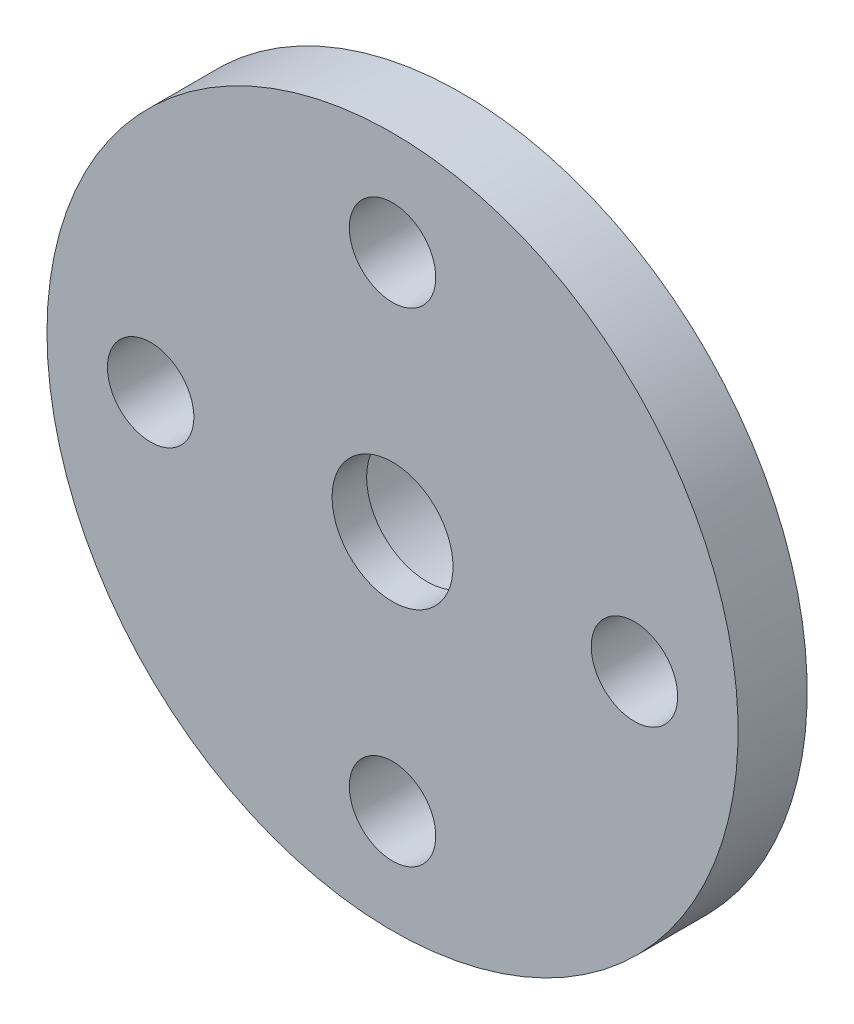
ISO-10303-21;
HEADER;
FILE_DESCRIPTION(('STEP AP214'),'2;1');
FILE_NAME('part.step','',(''),(''),'','','');
FILE_SCHEMA(('AUTOMOTIVE_DESIGN { 1 0 10303 214 1 1 1 1 }'));
ENDSEC;
DATA;
#1=APPLICATION_CONTEXT('core data for automotive mechanical design processes');
#2=APPLICATION_PROTOCOL_DEFINITION('international standard','automotive_design',2000,#1);
#3=PRODUCT_CONTEXT('',#1,'mechanical');
#4=PRODUCT('Part','Part','',(#3));
#5=PRODUCT_RELATED_PRODUCT_CATEGORY('part','',(#4));
#6=PRODUCT_DEFINITION_FORMATION('','',#4);
#7=PRODUCT_DEFINITION_CONTEXT('part definition',#1,'design');
#8=PRODUCT_DEFINITION('design','',#6,#7);
#9=PRODUCT_DEFINITION_SHAPE('','',#8);
#10=(LENGTH_UNIT() NAMED_UNIT(*) SI_UNIT(.MILLI.,.METRE.));
#11=(NAMED_UNIT(*) PLANE_ANGLE_UNIT() SI_UNIT($,.RADIAN.));
#12=(NAMED_UNIT(*) SI_UNIT($,.STERADIAN.) SOLID_ANGLE_UNIT());
#13=UNCERTAINTY_MEASURE_WITH_UNIT(LENGTH_MEASURE(1.E-05),#10,'distance_accuracy_value','');
#14=(GEOMETRIC_REPRESENTATION_CONTEXT(3) GLOBAL_UNCERTAINTY_ASSIGNED_CONTEXT((#13)) GLOBAL_UNIT_ASSIGNED_CONTEXT((#10,
#11,#12)) REPRESENTATION_CONTEXT('',''));
#15=CARTESIAN_POINT('',(0.,0.,0.));
#16=DIRECTION('',(0.,0.,1.));
#17=DIRECTION('',(1.,0.,0.));
#18=AXIS2_PLACEMENT_3D('',#15,#16,#17);
#19=CARTESIAN_POINT('',(0.,0.,-13.3602661537883));
#20=DIRECTION('',(0.,0.,-1.));
#21=DIRECTION('',(-1.,0.,0.));
#22=AXIS2_PLACEMENT_3D('',#19,#20,#21);
#23=CYLINDRICAL_SURFACE('',#22,1.75);
#24=CARTESIAN_POINT('',(0.,0.,-1.));
#25=DIRECTION('',(0.,0.,-1.));
#26=DIRECTION('',(-1.,0.,0.));
#27=AXIS2_PLACEMENT_3D('',#24,#25,#26);
#28=CIRCLE('',#27,1.75);
#29=CARTESIAN_POINT('',(-1.75,0.,-1.));
#30=VERTEX_POINT('',#29);
#31=EDGE_CURVE('E10',#30,#30,#28,.T.);
#32=ORIENTED_EDGE('',*,*,#31,.T.);
#33=EDGE_LOOP('',(#32));
#34=FACE_BOUND('',#33,.T.);
#35=CARTESIAN_POINT('',(0.,0.,0.));
#36=DIRECTION('',(0.,0.,-1.));
#37=DIRECTION('',(-1.,0.,0.));
#38=AXIS2_PLACEMENT_3D('',#35,#36,#37);
#39=CIRCLE('',#38,1.75);
#40=CARTESIAN_POINT('',(-1.75,0.,0.));
#41=VERTEX_POINT('',#40);
#42=EDGE_CURVE('E63',#41,#41,#39,.T.);
#43=ORIENTED_EDGE('',*,*,#42,.F.);
#44=EDGE_LOOP('',(#43));
#45=FACE_BOUND('',#44,.T.);
#46=ADVANCED_FACE('F35',(#34,#45),#23,.F.);
#47=CARTESIAN_POINT('',(-1.75,0.,-1.));
#48=DIRECTION('',(0.,0.,-1.));
#49=DIRECTION('',(-1.,0.,0.));
#50=AXIS2_PLACEMENT_3D('',#47,#48,#49);
#51=PLANE('',#50);
#52=CARTESIAN_POINT('',(0.,0.,-1.));
#53=DIRECTION('',(0.,0.,-1.));
#54=DIRECTION('',(-1.,0.,0.));
#55=AXIS2_PLACEMENT_3D('',#52,#53,#54);
#56=CIRCLE('',#55,2.75);
#57=CARTESIAN_POINT('',(-2.75,0.,-1.));
#58=VERTEX_POINT('',#57);
#59=EDGE_CURVE('E41',#58,#58,#56,.T.);
#60=ORIENTED_EDGE('',*,*,#59,.T.);
#61=EDGE_LOOP('',(#60));
#62=FACE_BOUND('',#61,.T.);
#63=ORIENTED_EDGE('',*,*,#31,.F.);
#64=EDGE_LOOP('',(#63));
#65=FACE_BOUND('',#64,.T.);
#66=ADVANCED_FACE('F123',(#62,#65),#51,.T.);
#67=CARTESIAN_POINT('',(0.,0.,-13.3602661537883));
#68=DIRECTION('',(0.,0.,-1.));
#69=DIRECTION('',(-1.,0.,0.));
#70=AXIS2_PLACEMENT_3D('',#67,#68,#69);
#71=CYLINDRICAL_SURFACE('',#70,2.75);
#72=CARTESIAN_POINT('',(0.,0.,-4.5));
#73=DIRECTION('',(0.,0.,-1.));
#74=DIRECTION('',(-1.,0.,0.));
#75=AXIS2_PLACEMENT_3D('',#72,#73,#74);
#76=CIRCLE('',#75,2.75);
#77=CARTESIAN_POINT('',(-2.75,0.,-4.5));
#78=VERTEX_POINT('',#77);
#79=EDGE_CURVE('E45',#78,#78,#76,.T.);
#80=ORIENTED_EDGE('',*,*,#79,.T.);
#81=EDGE_LOOP('',(#80));
#82=FACE_BOUND('',#81,.T.);
#83=ORIENTED_EDGE('',*,*,#59,.F.);
#84=EDGE_LOOP('',(#83));
#85=FACE_BOUND('',#84,.T.);
#86=ADVANCED_FACE('F117',(#82,#85),#71,.F.);
#87=CARTESIAN_POINT('',(-2.75,0.,-4.5));
#88=DIRECTION('',(0.,0.,-1.));
#89=DIRECTION('',(-1.,0.,0.));
#90=AXIS2_PLACEMENT_3D('',#87,#88,#89);
#91=PLANE('',#90);
#92=CARTESIAN_POINT('',(0.,0.,-4.5));
#93=DIRECTION('',(0.,0.,-1.));
#94=DIRECTION('',(-1.,0.,0.));
#95=AXIS2_PLACEMENT_3D('',#92,#93,#94);
#96=CIRCLE('',#95,4.5);
#97=CARTESIAN_POINT('',(-4.5,0.,-4.5));
#98=VERTEX_POINT('',#97);
#99=EDGE_CURVE('E49',#98,#98,#96,.T.);
#100=ORIENTED_EDGE('',*,*,#99,.T.);
#101=EDGE_LOOP('',(#100));
#102=FACE_BOUND('',#101,.T.);
#103=ORIENTED_EDGE('',*,*,#79,.F.);
#104=EDGE_LOOP('',(#103));
#105=FACE_BOUND('',#104,.T.);
#106=ADVANCED_FACE('F111',(#102,#105),#91,.T.);
#107=CARTESIAN_POINT('',(0.,0.,-13.3602661537883));
#108=DIRECTION('',(0.,0.,-1.));
#109=DIRECTION('',(-1.,0.,0.));
#110=AXIS2_PLACEMENT_3D('',#107,#108,#109);
#111=CYLINDRICAL_SURFACE('',#110,4.5);
#112=CARTESIAN_POINT('',(0.,0.,-2.));
#113=DIRECTION('',(0.,0.,-1.));
#114=DIRECTION('',(-1.,0.,0.));
#115=AXIS2_PLACEMENT_3D('',#112,#113,#114);
#116=CIRCLE('',#115,4.5);
#117=CARTESIAN_POINT('',(-4.5,0.,-2.));
#118=VERTEX_POINT('',#117);
#119=EDGE_CURVE('E54',#118,#118,#116,.T.);
#120=ORIENTED_EDGE('',*,*,#119,.T.);
#121=EDGE_LOOP('',(#120));
#122=FACE_BOUND('',#121,.T.);
#123=ORIENTED_EDGE('',*,*,#99,.F.);
#124=EDGE_LOOP('',(#123));
#125=FACE_BOUND('',#124,.T.);
#126=ADVANCED_FACE('F97',(#122,#125),#111,.T.);
#127=CARTESIAN_POINT('',(-4.5,0.,-2.));
#128=DIRECTION('',(0.,0.,-1.));
#129=DIRECTION('',(-1.,0.,0.));
#130=AXIS2_PLACEMENT_3D('',#127,#128,#129);
#131=PLANE('',#130);
#132=CARTESIAN_POINT('',(0.,7.,-2.));
#133=DIRECTION('',(0.,0.,-1.));
#134=DIRECTION('',(-1.,0.,0.));
#135=AXIS2_PLACEMENT_3D('',#132,#133,#134);
#136=CIRCLE('',#135,1.24999999999999);
#137=CARTESIAN_POINT('',(-1.24999999999999,7.,-2.));
#138=VERTEX_POINT('',#137);
#139=EDGE_CURVE('E87',#138,#138,#136,.T.);
#140=ORIENTED_EDGE('',*,*,#139,.F.);
#141=EDGE_LOOP('',(#140));
#142=FACE_BOUND('',#141,.T.);
#143=CARTESIAN_POINT('',(-7.,0.,-2.));
#144=DIRECTION('',(0.,0.,-1.));
#145=DIRECTION('',(-1.,0.,0.));
#146=AXIS2_PLACEMENT_3D('',#143,#144,#145);
#147=CIRCLE('',#146,1.24999999999999);
#148=CARTESIAN_POINT('',(-8.24999999999999,0.,-2.));
#149=VERTEX_POINT('',#148);
#150=EDGE_CURVE('E81',#149,#149,#147,.T.);
#151=ORIENTED_EDGE('',*,*,#150,.F.);
#152=EDGE_LOOP('',(#151));
#153=FACE_BOUND('',#152,.T.);
#154=CARTESIAN_POINT('',(0.,-7.,-2.));
#155=DIRECTION('',(0.,0.,-1.));
#156=DIRECTION('',(-1.,0.,0.));
#157=AXIS2_PLACEMENT_3D('',#154,#155,#156);
#158=CIRCLE('',#157,1.24999999999999);
#159=CARTESIAN_POINT('',(-1.24999999999999,-7.,-2.));
#160=VERTEX_POINT('',#159);
#161=EDGE_CURVE('E75',#160,#160,#158,.T.);
#162=ORIENTED_EDGE('',*,*,#161,.F.);
#163=EDGE_LOOP('',(#162));
#164=FACE_BOUND('',#163,.T.);
#165=CARTESIAN_POINT('',(7.,0.,-2.));
#166=DIRECTION('',(0.,0.,-1.));
#167=DIRECTION('',(-1.,0.,0.));
#168=AXIS2_PLACEMENT_3D('',#165,#166,#167);
#169=CIRCLE('',#168,1.24999999999999);
#170=CARTESIAN_POINT('',(5.75000000000001,0.,-2.));
#171=VERTEX_POINT('',#170);
#172=EDGE_CURVE('E69',#171,#171,#169,.T.);
#173=ORIENTED_EDGE('',*,*,#172,.F.);
#174=EDGE_LOOP('',(#173));
#175=FACE_BOUND('',#174,.T.);
#176=CARTESIAN_POINT('',(0.,0.,-2.));
#177=DIRECTION('',(0.,0.,-1.));
#178=DIRECTION('',(-1.,0.,0.));
#179=AXIS2_PLACEMENT_3D('',#176,#177,#178);
#180=CIRCLE('',#179,10.);
#181=CARTESIAN_POINT('',(-10.,0.,-2.));
#182=VERTEX_POINT('',#181);
#183=EDGE_CURVE('E57',#182,#182,#180,.T.);
#184=ORIENTED_EDGE('',*,*,#183,.T.);
#185=EDGE_LOOP('',(#184));
#186=FACE_BOUND('',#185,.T.);
#187=ORIENTED_EDGE('',*,*,#119,.F.);
#188=EDGE_LOOP('',(#187));
#189=FACE_BOUND('',#188,.T.);
#190=ADVANCED_FACE('F93',(#142,#153,#164,#175,#186,#189),#131,.T.);
#191=CARTESIAN_POINT('',(0.,0.,-13.3602661537883));
#192=DIRECTION('',(0.,0.,-1.));
#193=DIRECTION('',(-1.,0.,0.));
#194=AXIS2_PLACEMENT_3D('',#191,#192,#193);
#195=CYLINDRICAL_SURFACE('',#194,10.);
#196=CARTESIAN_POINT('',(0.,0.,0.));
#197=DIRECTION('',(0.,0.,-1.));
#198=DIRECTION('',(-1.,0.,0.));
#199=AXIS2_PLACEMENT_3D('',#196,#197,#198);
#200=CIRCLE('',#199,10.);
#201=CARTESIAN_POINT('',(-10.,0.,0.));
#202=VERTEX_POINT('',#201);
#203=EDGE_CURVE('E60',#202,#202,#200,.T.);
#204=ORIENTED_EDGE('',*,*,#203,.T.);
#205=EDGE_LOOP('',(#204));
#206=FACE_BOUND('',#205,.T.);
#207=ORIENTED_EDGE('',*,*,#183,.F.);
#208=EDGE_LOOP('',(#207));
#209=FACE_BOUND('',#208,.T.);
#210=ADVANCED_FACE('F96',(#206,#209),#195,.T.);
#211=CARTESIAN_POINT('',(-1.75,0.,0.));
#212=DIRECTION('',(0.,0.,1.));
#213=DIRECTION('',(1.,0.,0.));
#214=AXIS2_PLACEMENT_3D('',#211,#212,#213);
#215=PLANE('',#214);
#216=CARTESIAN_POINT('',(0.,7.,0.));
#217=DIRECTION('',(0.,0.,-1.));
#218=DIRECTION('',(-1.,0.,0.));
#219=AXIS2_PLACEMENT_3D('',#216,#217,#218);
#220=CIRCLE('',#219,1.25);
#221=CARTESIAN_POINT('',(-1.25,7.,0.));
#222=VERTEX_POINT('',#221);
#223=EDGE_CURVE('E84',#222,#222,#220,.T.);
#224=ORIENTED_EDGE('',*,*,#223,.T.);
#225=EDGE_LOOP('',(#224));
#226=FACE_BOUND('',#225,.T.);
#227=CARTESIAN_POINT('',(-7.,0.,0.));
#228=DIRECTION('',(0.,0.,-1.));
#229=DIRECTION('',(-1.,0.,0.));
#230=AXIS2_PLACEMENT_3D('',#227,#228,#229);
#231=CIRCLE('',#230,1.25);
#232=CARTESIAN_POINT('',(-8.25,0.,0.));
#233=VERTEX_POINT('',#232);
#234=EDGE_CURVE('E78',#233,#233,#231,.T.);
#235=ORIENTED_EDGE('',*,*,#234,.T.);
#236=EDGE_LOOP('',(#235));
#237=FACE_BOUND('',#236,.T.);
#238=CARTESIAN_POINT('',(0.,-7.,0.));
#239=DIRECTION('',(0.,0.,-1.));
#240=DIRECTION('',(-1.,0.,0.));
#241=AXIS2_PLACEMENT_3D('',#238,#239,#240);
#242=CIRCLE('',#241,1.25);
#243=CARTESIAN_POINT('',(-1.25,-7.,0.));
#244=VERTEX_POINT('',#243);
#245=EDGE_CURVE('E72',#244,#244,#242,.T.);
#246=ORIENTED_EDGE('',*,*,#245,.T.);
#247=EDGE_LOOP('',(#246));
#248=FACE_BOUND('',#247,.T.);
#249=CARTESIAN_POINT('',(7.,0.,0.));
#250=DIRECTION('',(0.,0.,-1.));
#251=DIRECTION('',(-1.,0.,0.));
#252=AXIS2_PLACEMENT_3D('',#249,#250,#251);
#253=CIRCLE('',#252,1.25);
#254=CARTESIAN_POINT('',(5.75,0.,0.));
#255=VERTEX_POINT('',#254);
#256=EDGE_CURVE('E66',#255,#255,#253,.T.);
#257=ORIENTED_EDGE('',*,*,#256,.T.);
#258=EDGE_LOOP('',(#257));
#259=FACE_BOUND('',#258,.T.);
#260=ORIENTED_EDGE('',*,*,#42,.T.);
#261=EDGE_LOOP('',(#260));
#262=FACE_BOUND('',#261,.T.);
#263=ORIENTED_EDGE('',*,*,#203,.F.);
#264=EDGE_LOOP('',(#263));
#265=FACE_BOUND('',#264,.T.);
#266=ADVANCED_FACE('F134',(#226,#237,#248,#259,#262,#265),#215,.T.);
#267=CARTESIAN_POINT('',(7.,0.,-2.));
#268=DIRECTION('',(0.,0.,-1.));
#269=DIRECTION('',(-1.,0.,0.));
#270=AXIS2_PLACEMENT_3D('',#267,#268,#269);
#271=CYLINDRICAL_SURFACE('',#270,1.24999999999999);
#272=ORIENTED_EDGE('',*,*,#256,.F.);
#273=EDGE_LOOP('',(#272));
#274=FACE_BOUND('',#273,.T.);
#275=ORIENTED_EDGE('',*,*,#172,.T.);
#276=EDGE_LOOP('',(#275));
#277=FACE_BOUND('',#276,.T.);
#278=ADVANCED_FACE('F137',(#274,#277),#271,.F.);
#279=CARTESIAN_POINT('',(0.,-7.,-2.));
#280=DIRECTION('',(0.,0.,-1.));
#281=DIRECTION('',(-1.,0.,0.));
#282=AXIS2_PLACEMENT_3D('',#279,#280,#281);
#283=CYLINDRICAL_SURFACE('',#282,1.24999999999999);
#284=ORIENTED_EDGE('',*,*,#245,.F.);
#285=EDGE_LOOP('',(#284));
#286=FACE_BOUND('',#285,.T.);
#287=ORIENTED_EDGE('',*,*,#161,.T.);
#288=EDGE_LOOP('',(#287));
#289=FACE_BOUND('',#288,.T.);
#290=ADVANCED_FACE('F150',(#286,#289),#283,.F.);
#291=CARTESIAN_POINT('',(-7.,0.,-2.));
#292=DIRECTION('',(0.,0.,-1.));
#293=DIRECTION('',(-1.,0.,0.));
#294=AXIS2_PLACEMENT_3D('',#291,#292,#293);
#295=CYLINDRICAL_SURFACE('',#294,1.24999999999999);
#296=ORIENTED_EDGE('',*,*,#234,.F.);
#297=EDGE_LOOP('',(#296));
#298=FACE_BOUND('',#297,.T.);
#299=ORIENTED_EDGE('',*,*,#150,.T.);
#300=EDGE_LOOP('',(#299));
#301=FACE_BOUND('',#300,.T.);
#302=ADVANCED_FACE('F154',(#298,#301),#295,.F.);
#303=CARTESIAN_POINT('',(0.,7.,-2.));
#304=DIRECTION('',(0.,0.,-1.));
#305=DIRECTION('',(-1.,0.,0.));
#306=AXIS2_PLACEMENT_3D('',#303,#304,#305);
#307=CYLINDRICAL_SURFACE('',#306,1.24999999999999);
#308=ORIENTED_EDGE('',*,*,#223,.F.);
#309=EDGE_LOOP('',(#308));
#310=FACE_BOUND('',#309,.T.);
#311=ORIENTED_EDGE('',*,*,#139,.T.);
#312=EDGE_LOOP('',(#311));
#313=FACE_BOUND('',#312,.T.);
#314=ADVANCED_FACE('F91',(#310,#313),#307,.F.);
#315=CLOSED_SHELL('',(#46,#66,#86,#106,#126,#190,#210,#266,#278,#290,#302,#314));
#316=MANIFOLD_SOLID_BREP('B2',#315);
#317=ADVANCED_BREP_SHAPE_REPRESENTATION('',(#18,#316),#14);
#318=SHAPE_DEFINITION_REPRESENTATION(#9,#317);
ENDSEC;
END-ISO-10303-21;
